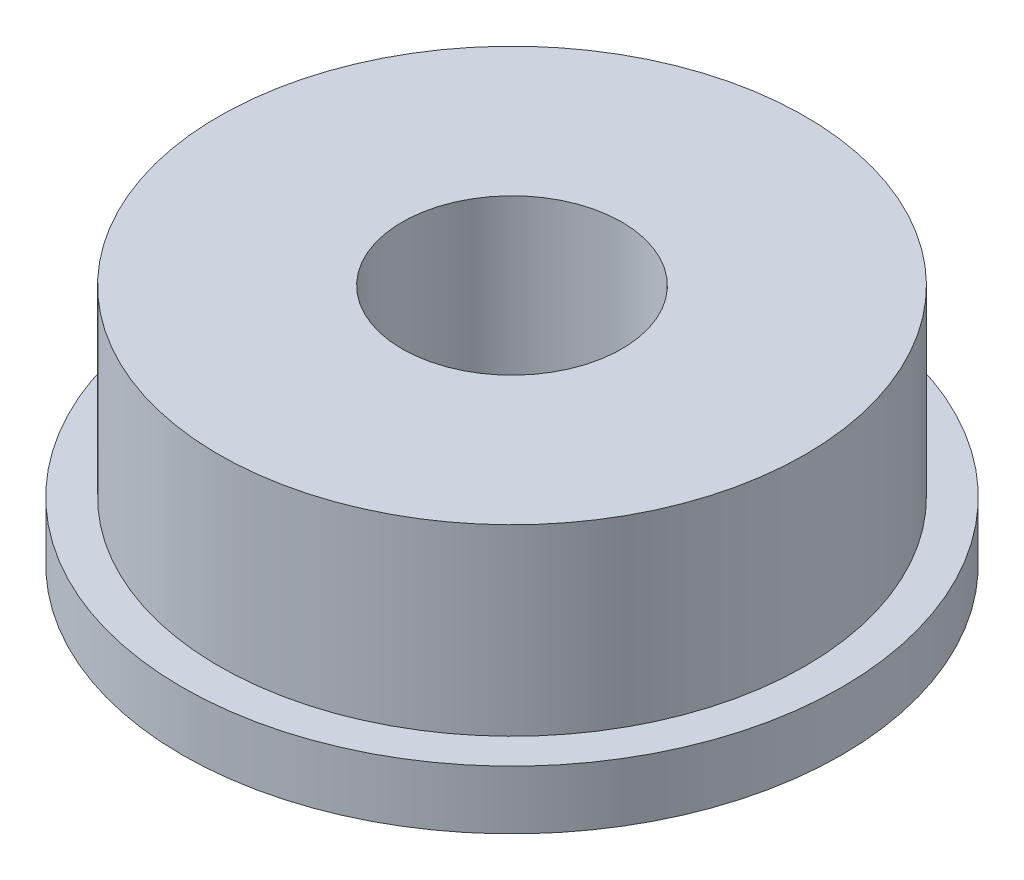
ISO-10303-21;
HEADER;
FILE_DESCRIPTION(('STEP AP214'),'2;1');
FILE_NAME('part.step','',(''),(''),'','','');
FILE_SCHEMA(('AUTOMOTIVE_DESIGN { 1 0 10303 214 1 1 1 1 }'));
ENDSEC;
DATA;
#1=APPLICATION_CONTEXT('core data for automotive mechanical design processes');
#2=APPLICATION_PROTOCOL_DEFINITION('international standard','automotive_design',2000,#1);
#3=PRODUCT_CONTEXT('',#1,'mechanical');
#4=PRODUCT('Part','Part','',(#3));
#5=PRODUCT_RELATED_PRODUCT_CATEGORY('part','',(#4));
#6=PRODUCT_DEFINITION_FORMATION('','',#4);
#7=PRODUCT_DEFINITION_CONTEXT('part definition',#1,'design');
#8=PRODUCT_DEFINITION('design','',#6,#7);
#9=PRODUCT_DEFINITION_SHAPE('','',#8);
#10=(LENGTH_UNIT() NAMED_UNIT(*) SI_UNIT(.MILLI.,.METRE.));
#11=(NAMED_UNIT(*) PLANE_ANGLE_UNIT() SI_UNIT($,.RADIAN.));
#12=(NAMED_UNIT(*) SI_UNIT($,.STERADIAN.) SOLID_ANGLE_UNIT());
#13=UNCERTAINTY_MEASURE_WITH_UNIT(LENGTH_MEASURE(1.E-05),#10,'distance_accuracy_value','');
#14=(GEOMETRIC_REPRESENTATION_CONTEXT(3) GLOBAL_UNCERTAINTY_ASSIGNED_CONTEXT((#13)) GLOBAL_UNIT_ASSIGNED_CONTEXT((#10,
#11,#12)) REPRESENTATION_CONTEXT('',''));
#15=CARTESIAN_POINT('',(0.,0.,0.));
#16=DIRECTION('',(0.,0.,1.));
#17=DIRECTION('',(1.,0.,0.));
#18=AXIS2_PLACEMENT_3D('',#15,#16,#17);
#19=CARTESIAN_POINT('',(0.,0.8,0.));
#20=DIRECTION('',(0.,-1.,0.));
#21=DIRECTION('',(0.,0.,-1.));
#22=AXIS2_PLACEMENT_3D('',#19,#20,#21);
#23=CYLINDRICAL_SURFACE('',#22,4.5);
#24=CARTESIAN_POINT('',(0.,0.8,0.));
#25=DIRECTION('',(0.,1.,0.));
#26=DIRECTION('',(0.,0.,1.));
#27=AXIS2_PLACEMENT_3D('',#24,#25,#26);
#28=CIRCLE('',#27,4.5);
#29=CARTESIAN_POINT('',(0.,0.8,4.5));
#30=VERTEX_POINT('',#29);
#31=EDGE_CURVE('E10',#30,#30,#28,.T.);
#32=ORIENTED_EDGE('',*,*,#31,.F.);
#33=EDGE_LOOP('',(#32));
#34=FACE_BOUND('',#33,.T.);
#35=CARTESIAN_POINT('',(0.,0.,0.));
#36=DIRECTION('',(0.,1.,0.));
#37=DIRECTION('',(0.,0.,1.));
#38=AXIS2_PLACEMENT_3D('',#35,#36,#37);
#39=CIRCLE('',#38,4.5);
#40=CARTESIAN_POINT('',(0.,0.,4.5));
#41=VERTEX_POINT('',#40);
#42=EDGE_CURVE('E45',#41,#41,#39,.T.);
#43=ORIENTED_EDGE('',*,*,#42,.T.);
#44=EDGE_LOOP('',(#43));
#45=FACE_BOUND('',#44,.T.);
#46=ADVANCED_FACE('F37',(#34,#45),#23,.T.);
#47=CARTESIAN_POINT('',(0.,0.8,0.));
#48=DIRECTION('',(0.,1.,0.));
#49=DIRECTION('',(0.,0.,1.));
#50=AXIS2_PLACEMENT_3D('',#47,#48,#49);
#51=PLANE('',#50);
#52=CARTESIAN_POINT('',(0.,0.8,0.));
#53=DIRECTION('',(0.,-1.,0.));
#54=DIRECTION('',(1.,0.,0.));
#55=AXIS2_PLACEMENT_3D('',#52,#53,#54);
#56=CIRCLE('',#55,4.);
#57=CARTESIAN_POINT('',(4.,0.799999999999972,0.));
#58=VERTEX_POINT('',#57);
#59=EDGE_CURVE('E53',#58,#58,#56,.T.);
#60=ORIENTED_EDGE('',*,*,#59,.T.);
#61=EDGE_LOOP('',(#60));
#62=FACE_BOUND('',#61,.T.);
#63=ORIENTED_EDGE('',*,*,#31,.T.);
#64=EDGE_LOOP('',(#63));
#65=FACE_BOUND('',#64,.T.);
#66=ADVANCED_FACE('F84',(#62,#65),#51,.T.);
#67=CARTESIAN_POINT('',(0.,0.,0.));
#68=DIRECTION('',(0.,1.,0.));
#69=DIRECTION('',(0.,0.,1.));
#70=AXIS2_PLACEMENT_3D('',#67,#68,#69);
#71=PLANE('',#70);
#72=CARTESIAN_POINT('',(0.,0.,0.));
#73=DIRECTION('',(0.,1.,0.));
#74=DIRECTION('',(0.,0.,1.));
#75=AXIS2_PLACEMENT_3D('',#72,#73,#74);
#76=CIRCLE('',#75,1.5);
#77=CARTESIAN_POINT('',(0.,0.,-1.5));
#78=VERTEX_POINT('',#77);
#79=EDGE_CURVE('E60',#78,#78,#76,.T.);
#80=ORIENTED_EDGE('',*,*,#79,.T.);
#81=EDGE_LOOP('',(#80));
#82=FACE_BOUND('',#81,.T.);
#83=ORIENTED_EDGE('',*,*,#42,.F.);
#84=EDGE_LOOP('',(#83));
#85=FACE_BOUND('',#84,.T.);
#86=ADVANCED_FACE('F80',(#82,#85),#71,.F.);
#87=CARTESIAN_POINT('',(0.,3.3,0.));
#88=DIRECTION('',(0.,-1.,0.));
#89=DIRECTION('',(1.,0.,0.));
#90=AXIS2_PLACEMENT_3D('',#87,#88,#89);
#91=CYLINDRICAL_SURFACE('',#90,4.);
#92=CARTESIAN_POINT('',(0.,3.3,0.));
#93=DIRECTION('',(0.,-1.,0.));
#94=DIRECTION('',(1.,0.,0.));
#95=AXIS2_PLACEMENT_3D('',#92,#93,#94);
#96=CIRCLE('',#95,4.);
#97=CARTESIAN_POINT('',(4.00000000000002,3.29999999999997,0.));
#98=VERTEX_POINT('',#97);
#99=EDGE_CURVE('E51',#98,#98,#96,.T.);
#100=ORIENTED_EDGE('',*,*,#99,.T.);
#101=EDGE_LOOP('',(#100));
#102=FACE_BOUND('',#101,.T.);
#103=ORIENTED_EDGE('',*,*,#59,.F.);
#104=EDGE_LOOP('',(#103));
#105=FACE_BOUND('',#104,.T.);
#106=ADVANCED_FACE('F74',(#102,#105),#91,.T.);
#107=CARTESIAN_POINT('',(0.,3.3,0.));
#108=DIRECTION('',(0.,-1.,0.));
#109=DIRECTION('',(1.,0.,0.));
#110=AXIS2_PLACEMENT_3D('',#107,#108,#109);
#111=PLANE('',#110);
#112=CARTESIAN_POINT('',(0.,3.3,0.));
#113=DIRECTION('',(0.,-1.,0.));
#114=DIRECTION('',(1.,0.,0.));
#115=AXIS2_PLACEMENT_3D('',#112,#113,#114);
#116=CIRCLE('',#115,1.5);
#117=CARTESIAN_POINT('',(0.,3.3,-1.5));
#118=VERTEX_POINT('',#117);
#119=EDGE_CURVE('E40',#118,#118,#116,.F.);
#120=ORIENTED_EDGE('',*,*,#119,.F.);
#121=EDGE_LOOP('',(#120));
#122=FACE_BOUND('',#121,.T.);
#123=ORIENTED_EDGE('',*,*,#99,.F.);
#124=EDGE_LOOP('',(#123));
#125=FACE_BOUND('',#124,.T.);
#126=ADVANCED_FACE('F71',(#122,#125),#111,.F.);
#127=CARTESIAN_POINT('',(0.,12.5,0.));
#128=DIRECTION('',(0.,-1.,0.));
#129=DIRECTION('',(0.,0.,-1.));
#130=AXIS2_PLACEMENT_3D('',#127,#128,#129);
#131=CYLINDRICAL_SURFACE('',#130,1.5);
#132=CARTESIAN_POINT('',(0.,0.,-1.5));
#133=CARTESIAN_POINT('',(0.,0.0343750000000003,-1.5));
#134=CARTESIAN_POINT('',(0.,0.0687500000000005,-1.5));
#135=CARTESIAN_POINT('',(0.,0.1375,-1.5));
#136=CARTESIAN_POINT('',(0.,0.171875,-1.5));
#137=CARTESIAN_POINT('',(0.,0.240625,-1.5));
#138=CARTESIAN_POINT('',(0.,0.275,-1.5));
#139=CARTESIAN_POINT('',(0.,0.34375,-1.5));
#140=CARTESIAN_POINT('',(0.,0.378125,-1.5));
#141=CARTESIAN_POINT('',(0.,0.446875,-1.5));
#142=CARTESIAN_POINT('',(0.,0.48125,-1.5));
#143=CARTESIAN_POINT('',(0.,0.55,-1.5));
#144=CARTESIAN_POINT('',(0.,0.584375,-1.5));
#145=CARTESIAN_POINT('',(0.,0.653125,-1.5));
#146=CARTESIAN_POINT('',(0.,0.6875,-1.5));
#147=CARTESIAN_POINT('',(0.,0.75625,-1.5));
#148=CARTESIAN_POINT('',(0.,0.790625,-1.5));
#149=CARTESIAN_POINT('',(0.,0.859375,-1.5));
#150=CARTESIAN_POINT('',(0.,0.89375,-1.5));
#151=CARTESIAN_POINT('',(0.,0.9625,-1.5));
#152=CARTESIAN_POINT('',(0.,0.996875000000001,-1.5));
#153=CARTESIAN_POINT('',(0.,1.065625,-1.5));
#154=CARTESIAN_POINT('',(0.,1.1,-1.5));
#155=CARTESIAN_POINT('',(0.,1.16875,-1.5));
#156=CARTESIAN_POINT('',(0.,1.203125,-1.5));
#157=CARTESIAN_POINT('',(0.,1.271875,-1.5));
#158=CARTESIAN_POINT('',(0.,1.30625,-1.5));
#159=CARTESIAN_POINT('',(0.,1.375,-1.5));
#160=CARTESIAN_POINT('',(0.,1.409375,-1.5));
#161=CARTESIAN_POINT('',(0.,1.478125,-1.5));
#162=CARTESIAN_POINT('',(0.,1.5125,-1.5));
#163=CARTESIAN_POINT('',(0.,1.58125,-1.5));
#164=CARTESIAN_POINT('',(0.,1.615625,-1.5));
#165=CARTESIAN_POINT('',(0.,1.684375,-1.5));
#166=CARTESIAN_POINT('',(0.,1.71875,-1.5));
#167=CARTESIAN_POINT('',(0.,1.7875,-1.5));
#168=CARTESIAN_POINT('',(0.,1.821875,-1.5));
#169=CARTESIAN_POINT('',(0.,1.890625,-1.5));
#170=CARTESIAN_POINT('',(0.,1.925,-1.5));
#171=CARTESIAN_POINT('',(0.,1.99375,-1.5));
#172=CARTESIAN_POINT('',(0.,2.028125,-1.5));
#173=CARTESIAN_POINT('',(0.,2.096875,-1.5));
#174=CARTESIAN_POINT('',(0.,2.13125,-1.5));
#175=CARTESIAN_POINT('',(0.,2.2,-1.5));
#176=CARTESIAN_POINT('',(0.,2.234375,-1.5));
#177=CARTESIAN_POINT('',(0.,2.303125,-1.5));
#178=CARTESIAN_POINT('',(0.,2.3375,-1.5));
#179=CARTESIAN_POINT('',(0.,2.40625,-1.5));
#180=CARTESIAN_POINT('',(0.,2.440625,-1.5));
#181=CARTESIAN_POINT('',(0.,2.509375,-1.5));
#182=CARTESIAN_POINT('',(0.,2.54375,-1.5));
#183=CARTESIAN_POINT('',(0.,2.6125,-1.5));
#184=CARTESIAN_POINT('',(0.,2.646875,-1.5));
#185=CARTESIAN_POINT('',(0.,2.715625,-1.5));
#186=CARTESIAN_POINT('',(0.,2.75,-1.5));
#187=CARTESIAN_POINT('',(0.,2.81875,-1.5));
#188=CARTESIAN_POINT('',(0.,2.853125,-1.5));
#189=CARTESIAN_POINT('',(0.,2.921875,-1.5));
#190=CARTESIAN_POINT('',(0.,2.95625,-1.5));
#191=CARTESIAN_POINT('',(0.,3.025,-1.5));
#192=CARTESIAN_POINT('',(0.,3.059375,-1.5));
#193=CARTESIAN_POINT('',(0.,3.128125,-1.5));
#194=CARTESIAN_POINT('',(0.,3.1625,-1.5));
#195=CARTESIAN_POINT('',(0.,3.23125,-1.5));
#196=CARTESIAN_POINT('',(0.,3.265625,-1.5));
#197=CARTESIAN_POINT('',(0.,3.3,-1.5));
#198=B_SPLINE_CURVE_WITH_KNOTS('',3,(#132,#133,#134,#135,#136,#137,#138,#139,#140,#141,#142,
#143,#144,#145,#146,#147,#148,#149,#150,#151,#152,#153,#154,#155,#156,#157,#158,#159,#160,#161,
#162,#163,#164,#165,#166,#167,#168,#169,#170,#171,#172,#173,#174,#175,#176,#177,#178,#179,#180,
#181,#182,#183,#184,#185,#186,#187,#188,#189,#190,#191,#192,#193,#194,#195,#196,#197),
.UNSPECIFIED.,.F.,.F.,(4,2,2,2,2,2,2,2,2,2,2,2,2,2,2,2,2,2,2,2,2,2,2,2,2,2,2,2,2,2,2,2,4),(0.,
0.103125000000001,0.20625,0.309375000000001,0.4125,0.515625,0.618749999999999,0.721875,
0.824999999999999,0.928125,1.03125,1.134375,1.2375,1.340625,1.44375,1.546875,1.65,1.753125,
1.85625,1.959375,2.0625,2.165625,2.26875,2.371875,2.475,2.578125,2.68125,2.784375,2.8875,
2.990625,3.09375,3.196875,3.3),.UNSPECIFIED.);
#199=EDGE_CURVE('BSEAM69',#78,#118,#198,.T.);
#200=ORIENTED_EDGE('',*,*,#79,.F.);
#201=ORIENTED_EDGE('',*,*,#119,.T.);
#202=ORIENTED_EDGE('',*,*,#199,.T.);
#203=ORIENTED_EDGE('',*,*,#199,.F.);
#204=EDGE_LOOP('',(#200,#202,#201,#203));
#205=FACE_BOUND('',#204,.T.);
#206=ADVANCED_FACE('F69',(#205),#131,.F.);
#207=CLOSED_SHELL('',(#46,#66,#86,#106,#126,#206));
#208=MANIFOLD_SOLID_BREP('B2',#207);
#209=ADVANCED_BREP_SHAPE_REPRESENTATION('',(#18,#208),#14);
#210=SHAPE_DEFINITION_REPRESENTATION(#9,#209);
ENDSEC;
END-ISO-10303-21;
